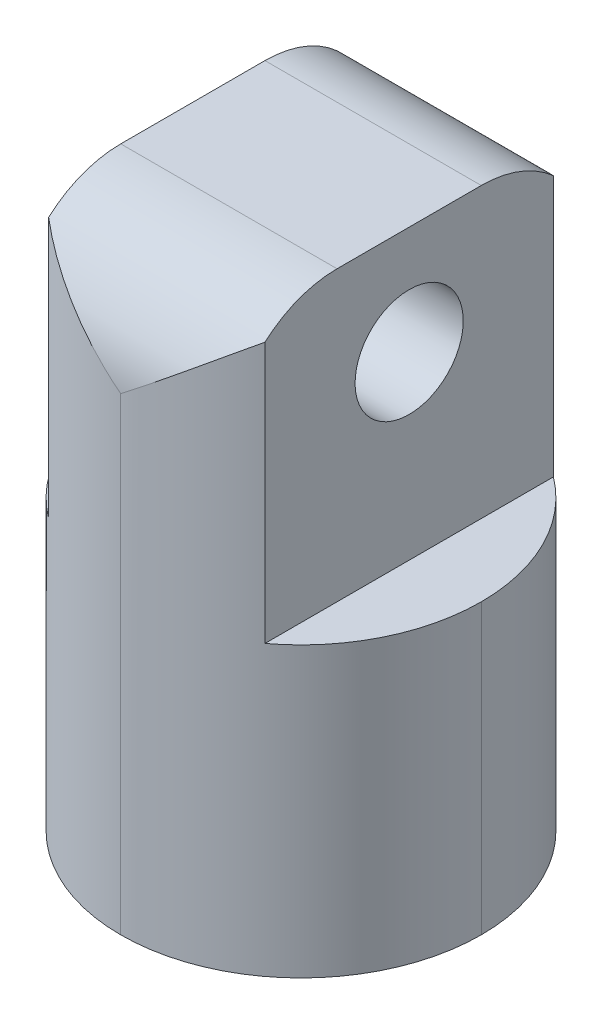
ISO-10303-21;
HEADER;
FILE_DESCRIPTION(('STEP AP214'),'2;1');
FILE_NAME('part.step','',(''),(''),'','','');
FILE_SCHEMA(('AUTOMOTIVE_DESIGN { 1 0 10303 214 1 1 1 1 }'));
ENDSEC;
DATA;
#1=APPLICATION_CONTEXT('core data for automotive mechanical design processes');
#2=APPLICATION_PROTOCOL_DEFINITION('international standard','automotive_design',2000,#1);
#3=PRODUCT_CONTEXT('',#1,'mechanical');
#4=PRODUCT('Part','Part','',(#3));
#5=PRODUCT_RELATED_PRODUCT_CATEGORY('part','',(#4));
#6=PRODUCT_DEFINITION_FORMATION('','',#4);
#7=PRODUCT_DEFINITION_CONTEXT('part definition',#1,'design');
#8=PRODUCT_DEFINITION('design','',#6,#7);
#9=PRODUCT_DEFINITION_SHAPE('','',#8);
#10=(LENGTH_UNIT() NAMED_UNIT(*) SI_UNIT(.MILLI.,.METRE.));
#11=(NAMED_UNIT(*) PLANE_ANGLE_UNIT() SI_UNIT($,.RADIAN.));
#12=(NAMED_UNIT(*) SI_UNIT($,.STERADIAN.) SOLID_ANGLE_UNIT());
#13=UNCERTAINTY_MEASURE_WITH_UNIT(LENGTH_MEASURE(1.E-05),#10,'distance_accuracy_value','');
#14=(GEOMETRIC_REPRESENTATION_CONTEXT(3) GLOBAL_UNCERTAINTY_ASSIGNED_CONTEXT((#13)) GLOBAL_UNIT_ASSIGNED_CONTEXT((#10,
#11,#12)) REPRESENTATION_CONTEXT('',''));
#15=CARTESIAN_POINT('',(0.,0.,0.));
#16=DIRECTION('',(0.,0.,1.));
#17=DIRECTION('',(1.,0.,0.));
#18=AXIS2_PLACEMENT_3D('',#15,#16,#17);
#19=CARTESIAN_POINT('',(0.,0.,50.));
#20=DIRECTION('',(0.,1.,0.));
#21=DIRECTION('',(0.,0.,1.));
#22=AXIS2_PLACEMENT_3D('',#19,#20,#21);
#23=PLANE('',#22);
#24=DIRECTION('',(0.,0.,-1.));
#25=VECTOR('',#24,1.);
#26=CARTESIAN_POINT('',(30.,0.,50.));
#27=LINE('',#26,#25);
#28=CARTESIAN_POINT('',(30.,0.,35.));
#29=VERTEX_POINT('',#28);
#30=CARTESIAN_POINT('',(30.,0.,15.));
#31=VERTEX_POINT('',#30);
#32=EDGE_CURVE('E136',#29,#31,#27,.T.);
#33=ORIENTED_EDGE('',*,*,#32,.T.);
#34=DIRECTION('',(1.,0.,0.));
#35=VECTOR('',#34,1.);
#36=CARTESIAN_POINT('',(0.,0.,15.));
#37=LINE('',#36,#35);
#38=CARTESIAN_POINT('',(0.,0.,15.));
#39=VERTEX_POINT('',#38);
#40=EDGE_CURVE('E140',#31,#39,#37,.F.);
#41=ORIENTED_EDGE('',*,*,#40,.T.);
#42=DIRECTION('',(0.,0.,-1.));
#43=VECTOR('',#42,1.);
#44=CARTESIAN_POINT('',(0.,0.,50.));
#45=LINE('',#44,#43);
#46=CARTESIAN_POINT('',(0.,0.,35.));
#47=VERTEX_POINT('',#46);
#48=EDGE_CURVE('E131',#47,#39,#45,.T.);
#49=ORIENTED_EDGE('',*,*,#48,.F.);
#50=DIRECTION('',(1.,0.,0.));
#51=VECTOR('',#50,1.);
#52=CARTESIAN_POINT('',(30.,0.,35.));
#53=LINE('',#52,#51);
#54=EDGE_CURVE('E124',#47,#29,#53,.T.);
#55=ORIENTED_EDGE('',*,*,#54,.T.);
#56=EDGE_LOOP('',(#33,#41,#49,#55));
#57=FACE_BOUND('',#56,.T.);
#58=ADVANCED_FACE('F41',(#57),#23,.T.);
#59=CARTESIAN_POINT('',(0.,0.,50.));
#60=DIRECTION('',(1.,0.,0.));
#61=DIRECTION('',(0.,1.,0.));
#62=AXIS2_PLACEMENT_3D('',#59,#60,#61);
#63=PLANE('',#62);
#64=CARTESIAN_POINT('',(0.,-15.,25.));
#65=DIRECTION('',(1.,0.,0.));
#66=DIRECTION('',(0.,1.,0.));
#67=AXIS2_PLACEMENT_3D('',#64,#65,#66);
#68=CIRCLE('',#67,7.5);
#69=CARTESIAN_POINT('',(0.,-7.5,25.));
#70=VERTEX_POINT('',#69);
#71=EDGE_CURVE('E145',#70,#70,#68,.T.);
#72=ORIENTED_EDGE('',*,*,#71,.T.);
#73=EDGE_LOOP('',(#72));
#74=FACE_BOUND('',#73,.T.);
#75=DIRECTION('',(0.,0.,-1.));
#76=VECTOR('',#75,1.);
#77=CARTESIAN_POINT('',(0.,-40.,50.));
#78=LINE('',#77,#76);
#79=CARTESIAN_POINT('',(0.,-40.,45.));
#80=VERTEX_POINT('',#79);
#81=CARTESIAN_POINT('',(0.,-40.,5.));
#82=VERTEX_POINT('',#81);
#83=EDGE_CURVE('E150',#80,#82,#78,.T.);
#84=ORIENTED_EDGE('',*,*,#83,.F.);
#85=DIRECTION('',(0.,-1.,0.));
#86=VECTOR('',#85,1.);
#87=CARTESIAN_POINT('',(0.,-40.,45.));
#88=LINE('',#87,#86);
#89=CARTESIAN_POINT('',(0.,-3.81966011250105,45.));
#90=VERTEX_POINT('',#89);
#91=EDGE_CURVE('E201',#80,#90,#88,.F.);
#92=ORIENTED_EDGE('',*,*,#91,.T.);
#93=CARTESIAN_POINT('',(0.,-15.,35.));
#94=DIRECTION('',(1.,0.,0.));
#95=DIRECTION('',(0.,1.,0.));
#96=AXIS2_PLACEMENT_3D('',#93,#94,#95);
#97=CIRCLE('',#96,15.);
#98=EDGE_CURVE('E161',#90,#47,#97,.F.);
#99=ORIENTED_EDGE('',*,*,#98,.T.);
#100=ORIENTED_EDGE('',*,*,#48,.T.);
#101=CARTESIAN_POINT('',(0.,-15.,15.));
#102=DIRECTION('',(1.,0.,0.));
#103=DIRECTION('',(0.,1.,0.));
#104=AXIS2_PLACEMENT_3D('',#101,#102,#103);
#105=CIRCLE('',#104,15.);
#106=CARTESIAN_POINT('',(0.,-3.81966011250105,5.));
#107=VERTEX_POINT('',#106);
#108=EDGE_CURVE('E164',#39,#107,#105,.F.);
#109=ORIENTED_EDGE('',*,*,#108,.T.);
#110=DIRECTION('',(0.,1.,0.));
#111=VECTOR('',#110,1.);
#112=CARTESIAN_POINT('',(0.,-3.81966011250105,5.));
#113=LINE('',#112,#111);
#114=EDGE_CURVE('E276',#107,#82,#113,.F.);
#115=ORIENTED_EDGE('',*,*,#114,.T.);
#116=EDGE_LOOP('',(#84,#92,#99,#100,#109,#115));
#117=FACE_BOUND('',#116,.T.);
#118=ADVANCED_FACE('F215',(#74,#117),#63,.F.);
#119=CARTESIAN_POINT('',(0.,-40.,50.));
#120=DIRECTION('',(0.,-1.,0.));
#121=DIRECTION('',(0.,0.,-1.));
#122=AXIS2_PLACEMENT_3D('',#119,#120,#121);
#123=PLANE('',#122);
#124=CARTESIAN_POINT('',(15.,-40.,25.));
#125=DIRECTION('',(0.,-1.,0.));
#126=DIRECTION('',(0.,0.,-1.));
#127=AXIS2_PLACEMENT_3D('',#124,#125,#126);
#128=CIRCLE('',#127,25.);
#129=CARTESIAN_POINT('',(-9.99999999999999,-40.,25.));
#130=VERTEX_POINT('',#129);
#131=EDGE_CURVE('E268',#82,#130,#128,.F.);
#132=ORIENTED_EDGE('',*,*,#131,.T.);
#133=CARTESIAN_POINT('',(15.,-40.,25.));
#134=DIRECTION('',(0.,-1.,0.));
#135=DIRECTION('',(0.,0.,-1.));
#136=AXIS2_PLACEMENT_3D('',#133,#134,#135);
#137=CIRCLE('',#136,25.);
#138=EDGE_CURVE('E271',#130,#80,#137,.F.);
#139=ORIENTED_EDGE('',*,*,#138,.T.);
#140=ORIENTED_EDGE('',*,*,#83,.T.);
#141=EDGE_LOOP('',(#132,#139,#140));
#142=FACE_BOUND('',#141,.T.);
#143=ADVANCED_FACE('F226',(#142),#123,.F.);
#144=CARTESIAN_POINT('',(-9.99999999999999,-80.,50.));
#145=DIRECTION('',(0.,1.,0.));
#146=DIRECTION('',(0.,0.,1.));
#147=AXIS2_PLACEMENT_3D('',#144,#145,#146);
#148=PLANE('',#147);
#149=CARTESIAN_POINT('',(15.,-80.,25.));
#150=DIRECTION('',(0.,-1.,0.));
#151=DIRECTION('',(0.,0.,-1.));
#152=AXIS2_PLACEMENT_3D('',#149,#150,#151);
#153=CIRCLE('',#152,7.5);
#154=CARTESIAN_POINT('',(15.,-80.,17.5));
#155=VERTEX_POINT('',#154);
#156=EDGE_CURVE('E252',#155,#155,#153,.T.);
#157=ORIENTED_EDGE('',*,*,#156,.F.);
#158=EDGE_LOOP('',(#157));
#159=FACE_BOUND('',#158,.T.);
#160=CARTESIAN_POINT('',(15.,-80.,25.));
#161=DIRECTION('',(0.,1.,0.));
#162=DIRECTION('',(0.,0.,1.));
#163=AXIS2_PLACEMENT_3D('',#160,#161,#162);
#164=CIRCLE('',#163,25.);
#165=CARTESIAN_POINT('',(15.,-80.,0.));
#166=VERTEX_POINT('',#165);
#167=CARTESIAN_POINT('',(40.,-80.,25.));
#168=VERTEX_POINT('',#167);
#169=EDGE_CURVE('E312',#166,#168,#164,.F.);
#170=ORIENTED_EDGE('',*,*,#169,.T.);
#171=CARTESIAN_POINT('',(15.,-80.,25.));
#172=DIRECTION('',(0.,1.,0.));
#173=DIRECTION('',(0.,0.,1.));
#174=AXIS2_PLACEMENT_3D('',#171,#172,#173);
#175=CIRCLE('',#174,25.);
#176=CARTESIAN_POINT('',(15.,-80.,50.));
#177=VERTEX_POINT('',#176);
#178=EDGE_CURVE('E281',#168,#177,#175,.F.);
#179=ORIENTED_EDGE('',*,*,#178,.T.);
#180=CARTESIAN_POINT('',(15.,-80.,25.));
#181=DIRECTION('',(0.,1.,0.));
#182=DIRECTION('',(0.,0.,1.));
#183=AXIS2_PLACEMENT_3D('',#180,#181,#182);
#184=CIRCLE('',#183,25.);
#185=CARTESIAN_POINT('',(-9.99999999999999,-80.,25.));
#186=VERTEX_POINT('',#185);
#187=EDGE_CURVE('E287',#177,#186,#184,.F.);
#188=ORIENTED_EDGE('',*,*,#187,.T.);
#189=CARTESIAN_POINT('',(15.,-80.,25.));
#190=DIRECTION('',(0.,1.,0.));
#191=DIRECTION('',(0.,0.,1.));
#192=AXIS2_PLACEMENT_3D('',#189,#190,#191);
#193=CIRCLE('',#192,25.);
#194=EDGE_CURVE('E315',#186,#166,#193,.F.);
#195=ORIENTED_EDGE('',*,*,#194,.T.);
#196=EDGE_LOOP('',(#170,#179,#188,#195));
#197=FACE_BOUND('',#196,.T.);
#198=ADVANCED_FACE('F222',(#159,#197),#148,.F.);
#199=CARTESIAN_POINT('',(40.,-40.,50.));
#200=DIRECTION('',(0.,-1.,0.));
#201=DIRECTION('',(0.,0.,-1.));
#202=AXIS2_PLACEMENT_3D('',#199,#200,#201);
#203=PLANE('',#202);
#204=DIRECTION('',(0.,0.,-1.));
#205=VECTOR('',#204,1.);
#206=CARTESIAN_POINT('',(30.,-40.,50.));
#207=LINE('',#206,#205);
#208=CARTESIAN_POINT('',(30.,-40.,45.));
#209=VERTEX_POINT('',#208);
#210=CARTESIAN_POINT('',(30.,-40.,5.));
#211=VERTEX_POINT('',#210);
#212=EDGE_CURVE('E144',#209,#211,#207,.T.);
#213=ORIENTED_EDGE('',*,*,#212,.F.);
#214=CARTESIAN_POINT('',(15.,-40.,25.));
#215=DIRECTION('',(0.,-1.,0.));
#216=DIRECTION('',(0.,0.,-1.));
#217=AXIS2_PLACEMENT_3D('',#214,#215,#216);
#218=CIRCLE('',#217,25.);
#219=CARTESIAN_POINT('',(40.,-40.,25.));
#220=VERTEX_POINT('',#219);
#221=EDGE_CURVE('E309',#209,#220,#218,.F.);
#222=ORIENTED_EDGE('',*,*,#221,.T.);
#223=CARTESIAN_POINT('',(15.,-40.,25.));
#224=DIRECTION('',(0.,-1.,0.));
#225=DIRECTION('',(0.,0.,-1.));
#226=AXIS2_PLACEMENT_3D('',#223,#224,#225);
#227=CIRCLE('',#226,25.);
#228=EDGE_CURVE('E304',#220,#211,#227,.F.);
#229=ORIENTED_EDGE('',*,*,#228,.T.);
#230=EDGE_LOOP('',(#213,#222,#229));
#231=FACE_BOUND('',#230,.T.);
#232=ADVANCED_FACE('F218',(#231),#203,.F.);
#233=CARTESIAN_POINT('',(30.,0.,50.));
#234=DIRECTION('',(1.,0.,0.));
#235=DIRECTION('',(0.,0.,-1.));
#236=AXIS2_PLACEMENT_3D('',#233,#234,#235);
#237=PLANE('',#236);
#238=CARTESIAN_POINT('',(30.,-15.,25.));
#239=DIRECTION('',(1.,0.,0.));
#240=DIRECTION('',(0.,1.,0.));
#241=AXIS2_PLACEMENT_3D('',#238,#239,#240);
#242=CIRCLE('',#241,7.5);
#243=CARTESIAN_POINT('',(30.,-7.5,25.));
#244=VERTEX_POINT('',#243);
#245=EDGE_CURVE('E153',#244,#244,#242,.T.);
#246=ORIENTED_EDGE('',*,*,#245,.F.);
#247=EDGE_LOOP('',(#246));
#248=FACE_BOUND('',#247,.T.);
#249=CARTESIAN_POINT('',(30.,-15.,35.));
#250=DIRECTION('',(1.,0.,0.));
#251=DIRECTION('',(0.,0.,-1.));
#252=AXIS2_PLACEMENT_3D('',#249,#250,#251);
#253=CIRCLE('',#252,15.);
#254=CARTESIAN_POINT('',(30.,-3.81966011250105,45.));
#255=VERTEX_POINT('',#254);
#256=EDGE_CURVE('E120',#29,#255,#253,.T.);
#257=ORIENTED_EDGE('',*,*,#256,.T.);
#258=DIRECTION('',(0.,1.,0.));
#259=VECTOR('',#258,1.);
#260=CARTESIAN_POINT('',(30.,-3.81966011250105,45.));
#261=LINE('',#260,#259);
#262=EDGE_CURVE('E298',#255,#209,#261,.F.);
#263=ORIENTED_EDGE('',*,*,#262,.T.);
#264=ORIENTED_EDGE('',*,*,#212,.T.);
#265=DIRECTION('',(0.,-1.,0.));
#266=VECTOR('',#265,1.);
#267=CARTESIAN_POINT('',(30.,-40.,5.));
#268=LINE('',#267,#266);
#269=CARTESIAN_POINT('',(30.,-3.81966011250105,5.));
#270=VERTEX_POINT('',#269);
#271=EDGE_CURVE('E300',#211,#270,#268,.F.);
#272=ORIENTED_EDGE('',*,*,#271,.T.);
#273=CARTESIAN_POINT('',(30.,-15.,15.));
#274=DIRECTION('',(1.,0.,0.));
#275=DIRECTION('',(0.,0.,-1.));
#276=AXIS2_PLACEMENT_3D('',#273,#274,#275);
#277=CIRCLE('',#276,15.);
#278=EDGE_CURVE('E130',#270,#31,#277,.T.);
#279=ORIENTED_EDGE('',*,*,#278,.T.);
#280=ORIENTED_EDGE('',*,*,#32,.F.);
#281=EDGE_LOOP('',(#257,#263,#264,#272,#279,#280));
#282=FACE_BOUND('',#281,.T.);
#283=ADVANCED_FACE('F142',(#248,#282),#237,.T.);
#284=CARTESIAN_POINT('',(0.,-15.,15.));
#285=DIRECTION('',(1.,0.,0.));
#286=DIRECTION('',(0.,0.,-1.));
#287=AXIS2_PLACEMENT_3D('',#284,#285,#286);
#288=CYLINDRICAL_SURFACE('',#287,15.);
#289=CARTESIAN_POINT('',(30.,-3.81966011250105,5.));
#290=CARTESIAN_POINT('',(29.6939348407592,-4.02498753275629,4.77046118303335));
#291=CARTESIAN_POINT('',(29.3847833932966,-4.23526611144354,4.54956468761824));
#292=CARTESIAN_POINT('',(28.7610755186165,-4.66459188792559,4.12476984797173));
#293=CARTESIAN_POINT('',(28.446520419337,-4.8836369484813,3.92086739756687));
#294=CARTESIAN_POINT('',(27.8129822342647,-5.32921048400368,3.52988442314963));
#295=CARTESIAN_POINT('',(27.4940045578528,-5.55573021664713,3.34278513766876));
#296=CARTESIAN_POINT('',(26.8518633353509,-6.01555922979535,2.98481263243969));
#297=CARTESIAN_POINT('',(26.5286994770833,-6.24886901829367,2.81394063082306));
#298=CARTESIAN_POINT('',(25.5555175439641,-6.95640674934918,2.32607599052749));
#299=CARTESIAN_POINT('',(24.8999796805047,-7.43953534622098,2.03271360430029));
#300=CARTESIAN_POINT('',(23.5779531356941,-8.42367545056133,1.50691619656449));
#301=CARTESIAN_POINT('',(22.9114616906998,-8.92469150970074,1.27449681007075));
#302=CARTESIAN_POINT('',(21.6473337404003,-9.88166021775721,0.891959274370091));
#303=CARTESIAN_POINT('',(21.0505478195715,-10.3362070044172,0.735465888715395));
#304=CARTESIAN_POINT('',(19.8525056496529,-11.2526797037901,0.467777814908145));
#305=CARTESIAN_POINT('',(19.2512493570658,-11.7146056883539,0.356583568111763));
#306=CARTESIAN_POINT('',(18.0464537386232,-12.6427701437302,0.178848003678551));
#307=CARTESIAN_POINT('',(17.4429171156202,-13.1090041139215,0.112264478557445));
#308=CARTESIAN_POINT('',(16.2345429076592,-14.0437354749725,0.0231560299336455));
#309=CARTESIAN_POINT('',(15.6297057967514,-14.512232099962,0.000617120498069834));
#310=CARTESIAN_POINT('',(15.0166666414839,-14.9870900751015,4.1678201408409E-06));
#311=CARTESIAN_POINT('',(15.0083333071248,-14.9935450481421,1.21668464742269E-09));
#312=CARTESIAN_POINT('',(15.,-15.,0.));
#313=B_SPLINE_CURVE_WITH_KNOTS('',3,(#289,#290,#291,#292,#293,#294,#295,#296,#297,#298,#299,
#300,#301,#302,#303,#304,#305,#306,#307,#308,#309,#310,#311,#312),.UNSPECIFIED.,.F.,.F.,(4,2,2,
2,2,2,2,2,2,2,2,4),(0.,1.30237585816971,2.60443611288018,3.90502400056432,5.20570944227991,
7.79958844045808,10.3941322523886,12.6917059617734,14.9893020562214,17.2847212476859,
19.5794114329312,19.6110342120034),.UNSPECIFIED.);
#314=CARTESIAN_POINT('',(15.,-15.,0.));
#315=VERTEX_POINT('',#314);
#316=EDGE_CURVE('E52',#270,#315,#313,.T.);
#317=ORIENTED_EDGE('',*,*,#316,.T.);
#318=CARTESIAN_POINT('',(0.,-3.81966011250105,5.));
#319=CARTESIAN_POINT('',(0.306065159240882,-4.02498753275637,4.77046118303325));
#320=CARTESIAN_POINT('',(0.615216606703677,-4.23526611144371,4.54956468761806));
#321=CARTESIAN_POINT('',(1.23892448138398,-4.66459188792594,4.1247698479714));
#322=CARTESIAN_POINT('',(1.55347958066365,-4.88363694848174,3.92086739756647));
#323=CARTESIAN_POINT('',(2.18701776573615,-5.32921048400428,3.52988442314912));
#324=CARTESIAN_POINT('',(2.5059954421482,-5.55573021664781,3.3427851376682));
#325=CARTESIAN_POINT('',(3.14813666465032,-6.01555922979619,2.98481263243905));
#326=CARTESIAN_POINT('',(3.47130052291799,-6.24886901829459,2.8139406308224));
#327=CARTESIAN_POINT('',(4.44448245603709,-6.95640674935003,2.32607599052696));
#328=CARTESIAN_POINT('',(5.10002031949624,-7.43953534622163,2.0327136042999));
#329=CARTESIAN_POINT('',(6.42204686430634,-8.42367545056171,1.50691619656432));
#330=CARTESIAN_POINT('',(7.08853830930034,-8.92469150970104,1.27449681007068));
#331=CARTESIAN_POINT('',(8.35266625959975,-9.88166021775709,0.891959274370098));
#332=CARTESIAN_POINT('',(8.94945218042875,-10.3362070044168,0.735465888715407));
#333=CARTESIAN_POINT('',(10.1474943503467,-11.2526797037904,0.46777781490816));
#334=CARTESIAN_POINT('',(10.7487506429331,-11.7146056883552,0.356583568111776));
#335=CARTESIAN_POINT('',(11.9535462613777,-12.6427701437287,0.178848003678561));
#336=CARTESIAN_POINT('',(12.5570828843837,-13.1090041139162,0.112264478557458));
#337=CARTESIAN_POINT('',(13.7654570923368,-14.0437354749776,0.0231560299336401));
#338=CARTESIAN_POINT('',(14.3702942032336,-14.5122320999813,0.000617120498045852));
#339=CARTESIAN_POINT('',(14.9833333585157,-14.987090075102,4.16782014018527E-06));
#340=CARTESIAN_POINT('',(14.991666692875,-14.9935450481423,1.21668431673646E-09));
#341=CARTESIAN_POINT('',(15.,-15.,0.));
#342=B_SPLINE_CURVE_WITH_KNOTS('',3,(#318,#319,#320,#321,#322,#323,#324,#325,#326,#327,#328,
#329,#330,#331,#332,#333,#334,#335,#336,#337,#338,#339,#340,#341),.UNSPECIFIED.,.F.,.F.,(4,2,2,
2,2,2,2,2,2,2,2,4),(0.,1.30237585817023,2.60443611288121,3.90502400056577,5.20570944228175,
7.79958844045897,10.3941322523886,12.6917059617733,14.9893020562212,17.2847212476858,
19.5794114329312,19.6110342120034),.UNSPECIFIED.);
#343=EDGE_CURVE('E11',#315,#107,#342,.F.);
#344=ORIENTED_EDGE('',*,*,#343,.T.);
#345=ORIENTED_EDGE('',*,*,#108,.F.);
#346=ORIENTED_EDGE('',*,*,#40,.F.);
#347=ORIENTED_EDGE('',*,*,#278,.F.);
#348=EDGE_LOOP('',(#317,#344,#345,#346,#347));
#349=FACE_BOUND('',#348,.T.);
#350=ADVANCED_FACE('F208',(#349),#288,.T.);
#351=CARTESIAN_POINT('',(0.,-15.,35.));
#352=DIRECTION('',(-1.,0.,0.));
#353=DIRECTION('',(0.,0.,1.));
#354=AXIS2_PLACEMENT_3D('',#351,#352,#353);
#355=CYLINDRICAL_SURFACE('',#354,15.);
#356=CARTESIAN_POINT('',(0.,-3.81966011250105,45.));
#357=CARTESIAN_POINT('',(0.306065159240916,-4.02498753275639,45.2295388169668));
#358=CARTESIAN_POINT('',(0.615216606703744,-4.23526611144376,45.450435312382));
#359=CARTESIAN_POINT('',(1.23892448138411,-4.66459188792603,45.8752301520287));
#360=CARTESIAN_POINT('',(1.55347958066381,-4.88363694848185,46.0791326024336));
#361=CARTESIAN_POINT('',(2.18701776573638,-5.32921048400445,46.470115576851));
#362=CARTESIAN_POINT('',(2.50599544214846,-5.555730216648,46.6572148623319));
#363=CARTESIAN_POINT('',(3.14813666465063,-6.01555922979642,47.0151873675611));
#364=CARTESIAN_POINT('',(3.47130052291833,-6.24886901829484,47.1860593691778));
#365=CARTESIAN_POINT('',(4.4444824560374,-6.95640674935025,47.6739240094732));
#366=CARTESIAN_POINT('',(5.10002031949649,-7.4395353462218,47.9672863957002));
#367=CARTESIAN_POINT('',(6.42204686430646,-8.4236754505618,48.4930838034357));
#368=CARTESIAN_POINT('',(7.08853830930038,-8.92469150970111,48.7255031899293));
#369=CARTESIAN_POINT('',(8.35266625959976,-9.88166021775706,49.1080407256299));
#370=CARTESIAN_POINT('',(8.94945218042879,-10.3362070044167,49.2645341112846));
#371=CARTESIAN_POINT('',(10.1474943503466,-11.2526797037904,49.5322221850918));
#372=CARTESIAN_POINT('',(10.7487506429328,-11.7146056883555,49.6434164318882));
#373=CARTESIAN_POINT('',(11.953546261378,-12.6427701437284,49.8211519963214));
#374=CARTESIAN_POINT('',(12.5570828843846,-13.109004113915,49.8877355214426));
#375=CARTESIAN_POINT('',(13.7654570923358,-14.0437354749788,49.9768439700664));
#376=CARTESIAN_POINT('',(14.3702942032301,-14.5122320999858,49.9993828795019));
#377=CARTESIAN_POINT('',(14.9833333585156,-14.9870900751022,49.9999958321799));
#378=CARTESIAN_POINT('',(14.9916666928749,-14.9935450481424,49.9999999987833));
#379=CARTESIAN_POINT('',(15.,-15.,50.));
#380=B_SPLINE_CURVE_WITH_KNOTS('',3,(#356,#357,#358,#359,#360,#361,#362,#363,#364,#365,#366,
#367,#368,#369,#370,#371,#372,#373,#374,#375,#376,#377,#378,#379),.UNSPECIFIED.,.F.,.F.,(4,2,2,
2,2,2,2,2,2,2,2,4),(0.,1.30237585817036,2.60443611288149,3.90502400056615,5.20570944228225,
7.7995884404592,10.3941322523886,12.6917059617733,14.9893020562212,17.2847212476858,
19.5794114329312,19.6110342120034),.UNSPECIFIED.);
#381=CARTESIAN_POINT('',(15.,-15.,50.));
#382=VERTEX_POINT('',#381);
#383=EDGE_CURVE('E167',#90,#382,#380,.T.);
#384=ORIENTED_EDGE('',*,*,#383,.T.);
#385=CARTESIAN_POINT('',(30.,-3.81966011250105,45.));
#386=CARTESIAN_POINT('',(29.6939348407591,-4.02498753275639,45.2295388169668));
#387=CARTESIAN_POINT('',(29.3847833932962,-4.23526611144375,45.450435312382));
#388=CARTESIAN_POINT('',(28.7610755186159,-4.66459188792603,45.8752301520287));
#389=CARTESIAN_POINT('',(28.4465204193362,-4.88363694848185,46.0791326024336));
#390=CARTESIAN_POINT('',(27.8129822342636,-5.32921048400445,46.470115576851));
#391=CARTESIAN_POINT('',(27.4940045578515,-5.55573021664799,46.6572148623319));
#392=CARTESIAN_POINT('',(26.8518633353494,-6.01555922979642,47.0151873675611));
#393=CARTESIAN_POINT('',(26.5286994770817,-6.24886901829485,47.1860593691778));
#394=CARTESIAN_POINT('',(25.5555175439626,-6.95640674935026,47.6739240094732));
#395=CARTESIAN_POINT('',(24.8999796805035,-7.4395353462218,47.9672863957002));
#396=CARTESIAN_POINT('',(23.5779531356935,-8.4236754505618,48.4930838034357));
#397=CARTESIAN_POINT('',(22.9114616906996,-8.92469150970111,48.7255031899293));
#398=CARTESIAN_POINT('',(21.6473337404002,-9.88166021775705,49.1080407256299));
#399=CARTESIAN_POINT('',(21.0505478195712,-10.3362070044167,49.2645341112846));
#400=CARTESIAN_POINT('',(19.8525056496534,-11.2526797037904,49.5322221850918));
#401=CARTESIAN_POINT('',(19.2512493570672,-11.7146056883555,49.6434164318882));
#402=CARTESIAN_POINT('',(18.046453738622,-12.6427701437283,49.8211519963214));
#403=CARTESIAN_POINT('',(17.4429171156153,-13.1090041139149,49.8877355214426));
#404=CARTESIAN_POINT('',(16.2345429076642,-14.0437354749789,49.9768439700664));
#405=CARTESIAN_POINT('',(15.6297057967701,-14.512232099986,49.9993828795019));
#406=CARTESIAN_POINT('',(15.0166666414844,-14.9870900751022,49.9999958321799));
#407=CARTESIAN_POINT('',(15.0083333071251,-14.9935450481424,49.9999999987833));
#408=CARTESIAN_POINT('',(15.,-15.,50.));
#409=B_SPLINE_CURVE_WITH_KNOTS('',3,(#385,#386,#387,#388,#389,#390,#391,#392,#393,#394,#395,
#396,#397,#398,#399,#400,#401,#402,#403,#404,#405,#406,#407,#408),.UNSPECIFIED.,.F.,.F.,(4,2,2,
2,2,2,2,2,2,2,2,4),(0.,1.30237585817037,2.6044361128815,3.90502400056617,5.20570944228227,
7.79958844045921,10.3941322523886,12.6917059617733,14.9893020562212,17.2847212476858,
19.5794114329312,19.6110342120034),.UNSPECIFIED.);
#410=EDGE_CURVE('E126',#382,#255,#409,.F.);
#411=ORIENTED_EDGE('',*,*,#410,.T.);
#412=ORIENTED_EDGE('',*,*,#256,.F.);
#413=ORIENTED_EDGE('',*,*,#54,.F.);
#414=ORIENTED_EDGE('',*,*,#98,.F.);
#415=EDGE_LOOP('',(#384,#411,#412,#413,#414));
#416=FACE_BOUND('',#415,.T.);
#417=ADVANCED_FACE('F122',(#416),#355,.T.);
#418=CARTESIAN_POINT('',(0.,-15.,25.));
#419=DIRECTION('',(1.,0.,0.));
#420=DIRECTION('',(0.,1.,0.));
#421=AXIS2_PLACEMENT_3D('',#418,#419,#420);
#422=CYLINDRICAL_SURFACE('',#421,7.5);
#423=ORIENTED_EDGE('',*,*,#71,.F.);
#424=EDGE_LOOP('',(#423));
#425=FACE_BOUND('',#424,.T.);
#426=ORIENTED_EDGE('',*,*,#245,.T.);
#427=EDGE_LOOP('',(#426));
#428=FACE_BOUND('',#427,.T.);
#429=ADVANCED_FACE('F234',(#425,#428),#422,.F.);
#430=CARTESIAN_POINT('',(15.,-40.,25.));
#431=DIRECTION('',(0.,1.,0.));
#432=DIRECTION('',(-1.,0.,0.));
#433=AXIS2_PLACEMENT_3D('',#430,#431,#432);
#434=CYLINDRICAL_SURFACE('',#433,25.);
#435=ORIENTED_EDGE('',*,*,#114,.F.);
#436=ORIENTED_EDGE('',*,*,#343,.F.);
#437=DIRECTION('',(0.,-1.,0.));
#438=VECTOR('',#437,1.);
#439=CARTESIAN_POINT('',(15.,-40.,0.));
#440=LINE('',#439,#438);
#441=EDGE_CURVE('E46',#166,#315,#440,.F.);
#442=ORIENTED_EDGE('',*,*,#441,.F.);
#443=ORIENTED_EDGE('',*,*,#194,.F.);
#444=DIRECTION('',(0.,-1.,0.));
#445=VECTOR('',#444,1.);
#446=CARTESIAN_POINT('',(-9.99999999999999,-80.,25.));
#447=LINE('',#446,#445);
#448=EDGE_CURVE('E279',#130,#186,#447,.T.);
#449=ORIENTED_EDGE('',*,*,#448,.F.);
#450=ORIENTED_EDGE('',*,*,#131,.F.);
#451=EDGE_LOOP('',(#435,#436,#442,#443,#449,#450));
#452=FACE_BOUND('',#451,.T.);
#453=ADVANCED_FACE('F43',(#452),#434,.T.);
#454=CARTESIAN_POINT('',(15.,-80.,25.));
#455=DIRECTION('',(0.,-1.,0.));
#456=DIRECTION('',(0.,0.,-1.));
#457=AXIS2_PLACEMENT_3D('',#454,#455,#456);
#458=CYLINDRICAL_SURFACE('',#457,25.);
#459=ORIENTED_EDGE('',*,*,#271,.F.);
#460=ORIENTED_EDGE('',*,*,#228,.F.);
#461=DIRECTION('',(0.,1.,0.));
#462=VECTOR('',#461,1.);
#463=CARTESIAN_POINT('',(40.,-40.,25.));
#464=LINE('',#463,#462);
#465=EDGE_CURVE('E256',#168,#220,#464,.T.);
#466=ORIENTED_EDGE('',*,*,#465,.F.);
#467=ORIENTED_EDGE('',*,*,#169,.F.);
#468=ORIENTED_EDGE('',*,*,#441,.T.);
#469=ORIENTED_EDGE('',*,*,#316,.F.);
#470=EDGE_LOOP('',(#459,#460,#466,#467,#468,#469));
#471=FACE_BOUND('',#470,.T.);
#472=ADVANCED_FACE('F188',(#471),#458,.T.);
#473=CARTESIAN_POINT('',(15.,0.,25.));
#474=DIRECTION('',(0.,-1.,0.));
#475=DIRECTION('',(1.,0.,0.));
#476=AXIS2_PLACEMENT_3D('',#473,#474,#475);
#477=CYLINDRICAL_SURFACE('',#476,25.);
#478=ORIENTED_EDGE('',*,*,#448,.T.);
#479=ORIENTED_EDGE('',*,*,#187,.F.);
#480=DIRECTION('',(0.,-1.,0.));
#481=VECTOR('',#480,1.);
#482=CARTESIAN_POINT('',(15.,0.,50.));
#483=LINE('',#482,#481);
#484=EDGE_CURVE('E251',#382,#177,#483,.T.);
#485=ORIENTED_EDGE('',*,*,#484,.F.);
#486=ORIENTED_EDGE('',*,*,#383,.F.);
#487=ORIENTED_EDGE('',*,*,#91,.F.);
#488=ORIENTED_EDGE('',*,*,#138,.F.);
#489=EDGE_LOOP('',(#478,#479,#485,#486,#487,#488));
#490=FACE_BOUND('',#489,.T.);
#491=ADVANCED_FACE('F184',(#490),#477,.T.);
#492=CARTESIAN_POINT('',(15.,0.,25.));
#493=DIRECTION('',(0.,1.,0.));
#494=DIRECTION('',(0.,0.,1.));
#495=AXIS2_PLACEMENT_3D('',#492,#493,#494);
#496=CYLINDRICAL_SURFACE('',#495,25.);
#497=ORIENTED_EDGE('',*,*,#178,.F.);
#498=ORIENTED_EDGE('',*,*,#465,.T.);
#499=ORIENTED_EDGE('',*,*,#221,.F.);
#500=ORIENTED_EDGE('',*,*,#262,.F.);
#501=ORIENTED_EDGE('',*,*,#410,.F.);
#502=ORIENTED_EDGE('',*,*,#484,.T.);
#503=EDGE_LOOP('',(#497,#498,#499,#500,#501,#502));
#504=FACE_BOUND('',#503,.T.);
#505=ADVANCED_FACE('F187',(#504),#496,.T.);
#506=CARTESIAN_POINT('',(15.,-72.5,25.));
#507=DIRECTION('',(0.,-1.,0.));
#508=DIRECTION('',(0.,0.,-1.));
#509=AXIS2_PLACEMENT_3D('',#506,#507,#508);
#510=CYLINDRICAL_SURFACE('',#509,7.5);
#511=CARTESIAN_POINT('',(15.,-72.5,25.));
#512=DIRECTION('',(0.,-1.,0.));
#513=DIRECTION('',(0.,0.,-1.));
#514=AXIS2_PLACEMENT_3D('',#511,#512,#513);
#515=CIRCLE('',#514,7.5);
#516=CARTESIAN_POINT('',(15.,-72.5,17.5));
#517=VERTEX_POINT('',#516);
#518=EDGE_CURVE('E249',#517,#517,#515,.T.);
#519=ORIENTED_EDGE('',*,*,#518,.F.);
#520=EDGE_LOOP('',(#519));
#521=FACE_BOUND('',#520,.T.);
#522=ORIENTED_EDGE('',*,*,#156,.T.);
#523=EDGE_LOOP('',(#522));
#524=FACE_BOUND('',#523,.T.);
#525=ADVANCED_FACE('F238',(#521,#524),#510,.F.);
#526=CARTESIAN_POINT('',(15.,-72.5,25.));
#527=DIRECTION('',(0.,-1.,0.));
#528=DIRECTION('',(0.,0.,-1.));
#529=AXIS2_PLACEMENT_3D('',#526,#527,#528);
#530=PLANE('',#529);
#531=ORIENTED_EDGE('',*,*,#518,.T.);
#532=EDGE_LOOP('',(#531));
#533=FACE_BOUND('',#532,.T.);
#534=ADVANCED_FACE('F241',(#533),#530,.T.);
#535=CLOSED_SHELL('',(#58,#118,#143,#198,#232,#283,#350,#417,#429,#453,#472,#491,#505,#525,#534));
#536=MANIFOLD_SOLID_BREP('B2',#535);
#537=ADVANCED_BREP_SHAPE_REPRESENTATION('',(#18,#536),#14);
#538=SHAPE_DEFINITION_REPRESENTATION(#9,#537);
ENDSEC;
END-ISO-10303-21;
